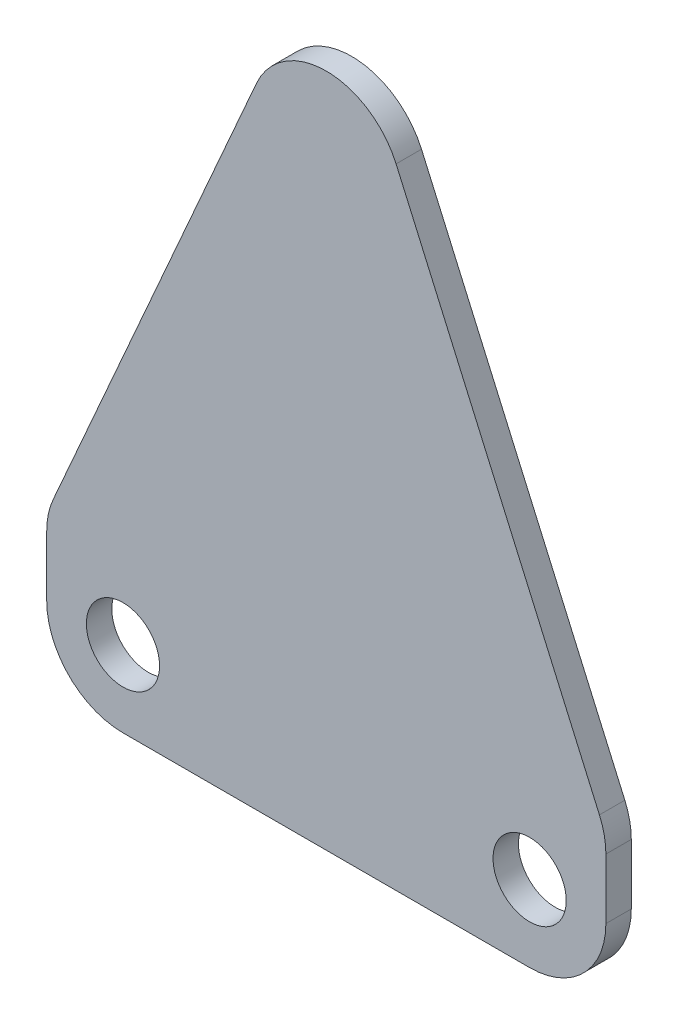
ISO-10303-21;
HEADER;
FILE_DESCRIPTION(('STEP AP214'),'2;1');
FILE_NAME('part.step','',(''),(''),'','','');
FILE_SCHEMA(('AUTOMOTIVE_DESIGN { 1 0 10303 214 1 1 1 1 }'));
ENDSEC;
DATA;
#1=APPLICATION_CONTEXT('core data for automotive mechanical design processes');
#2=APPLICATION_PROTOCOL_DEFINITION('international standard','automotive_design',2000,#1);
#3=PRODUCT_CONTEXT('',#1,'mechanical');
#4=PRODUCT('Part','Part','',(#3));
#5=PRODUCT_RELATED_PRODUCT_CATEGORY('part','',(#4));
#6=PRODUCT_DEFINITION_FORMATION('','',#4);
#7=PRODUCT_DEFINITION_CONTEXT('part definition',#1,'design');
#8=PRODUCT_DEFINITION('design','',#6,#7);
#9=PRODUCT_DEFINITION_SHAPE('','',#8);
#10=(LENGTH_UNIT() NAMED_UNIT(*) SI_UNIT(.MILLI.,.METRE.));
#11=(NAMED_UNIT(*) PLANE_ANGLE_UNIT() SI_UNIT($,.RADIAN.));
#12=(NAMED_UNIT(*) SI_UNIT($,.STERADIAN.) SOLID_ANGLE_UNIT());
#13=UNCERTAINTY_MEASURE_WITH_UNIT(LENGTH_MEASURE(1.E-05),#10,'distance_accuracy_value','');
#14=(GEOMETRIC_REPRESENTATION_CONTEXT(3) GLOBAL_UNCERTAINTY_ASSIGNED_CONTEXT((#13)) GLOBAL_UNIT_ASSIGNED_CONTEXT((#10,
#11,#12)) REPRESENTATION_CONTEXT('',''));
#15=CARTESIAN_POINT('',(0.,0.,0.));
#16=DIRECTION('',(0.,0.,1.));
#17=DIRECTION('',(1.,0.,0.));
#18=AXIS2_PLACEMENT_3D('',#15,#16,#17);
#19=CARTESIAN_POINT('',(0.,0.,1.5875));
#20=DIRECTION('',(0.,0.,-1.));
#21=DIRECTION('',(-1.,0.,0.));
#22=AXIS2_PLACEMENT_3D('',#19,#20,#21);
#23=PLANE('',#22);
#24=DIRECTION('',(0.,-1.,0.));
#25=VECTOR('',#24,1.);
#26=CARTESIAN_POINT('',(-17.4625,9.525,1.5875));
#27=LINE('',#26,#25);
#28=CARTESIAN_POINT('',(-17.4625,8.52357589066396,1.5875));
#29=VERTEX_POINT('',#28);
#30=CARTESIAN_POINT('',(-17.4625,4.7625,1.5875));
#31=VERTEX_POINT('',#30);
#32=EDGE_CURVE('E237',#29,#31,#27,.T.);
#33=ORIENTED_EDGE('',*,*,#32,.T.);
#34=CARTESIAN_POINT('',(-12.7,4.7625,1.5875));
#35=DIRECTION('',(0.,0.,-1.));
#36=DIRECTION('',(-1.,0.,0.));
#37=AXIS2_PLACEMENT_3D('',#34,#35,#36);
#38=CIRCLE('',#37,4.7625);
#39=CARTESIAN_POINT('',(-12.7,0.,1.5875));
#40=VERTEX_POINT('',#39);
#41=EDGE_CURVE('E198',#31,#40,#38,.F.);
#42=ORIENTED_EDGE('',*,*,#41,.T.);
#43=DIRECTION('',(1.,0.,0.));
#44=VECTOR('',#43,1.);
#45=CARTESIAN_POINT('',(-17.4625,0.,1.5875));
#46=LINE('',#45,#44);
#47=CARTESIAN_POINT('',(12.7,0.,1.5875));
#48=VERTEX_POINT('',#47);
#49=EDGE_CURVE('E149',#40,#48,#46,.T.);
#50=ORIENTED_EDGE('',*,*,#49,.T.);
#51=CARTESIAN_POINT('',(12.7,4.7625,1.5875));
#52=DIRECTION('',(0.,0.,-1.));
#53=DIRECTION('',(-1.,0.,0.));
#54=AXIS2_PLACEMENT_3D('',#51,#52,#53);
#55=CIRCLE('',#54,4.7625);
#56=CARTESIAN_POINT('',(17.4625,4.7625,1.5875));
#57=VERTEX_POINT('',#56);
#58=EDGE_CURVE('E192',#48,#57,#55,.F.);
#59=ORIENTED_EDGE('',*,*,#58,.T.);
#60=DIRECTION('',(0.,1.,0.));
#61=VECTOR('',#60,1.);
#62=CARTESIAN_POINT('',(17.4625,0.,1.5875));
#63=LINE('',#62,#61);
#64=CARTESIAN_POINT('',(17.4625,8.52357589066395,1.5875));
#65=VERTEX_POINT('',#64);
#66=EDGE_CURVE('E159',#57,#65,#63,.T.);
#67=ORIENTED_EDGE('',*,*,#66,.T.);
#68=CARTESIAN_POINT('',(12.7,8.52357589066395,1.5875));
#69=DIRECTION('',(0.,0.,-1.));
#70=DIRECTION('',(-1.,0.,0.));
#71=AXIS2_PLACEMENT_3D('',#68,#69,#70);
#72=CIRCLE('',#71,4.7625);
#73=CARTESIAN_POINT('',(17.0591878419134,10.4416185411059,1.5875));
#74=VERTEX_POINT('',#73);
#75=EDGE_CURVE('E187',#65,#74,#72,.F.);
#76=ORIENTED_EDGE('',*,*,#75,.T.);
#77=DIRECTION('',(-0.402738614266017,0.915315032422766,0.));
#78=VECTOR('',#77,1.);
#79=CARTESIAN_POINT('',(17.4625,9.525,1.5875));
#80=LINE('',#79,#78);
#81=CARTESIAN_POINT('',(4.35918784191342,39.3052549047422,1.5875));
#82=VERTEX_POINT('',#81);
#83=EDGE_CURVE('E165',#74,#82,#80,.T.);
#84=ORIENTED_EDGE('',*,*,#83,.T.);
#85=CARTESIAN_POINT('',(0.,37.3872122543003,1.5875));
#86=DIRECTION('',(0.,0.,-1.));
#87=DIRECTION('',(-1.,0.,0.));
#88=AXIS2_PLACEMENT_3D('',#85,#86,#87);
#89=CIRCLE('',#88,4.7625);
#90=CARTESIAN_POINT('',(-4.35918784191342,39.3052549047422,1.5875));
#91=VERTEX_POINT('',#90);
#92=EDGE_CURVE('E72',#82,#91,#89,.F.);
#93=ORIENTED_EDGE('',*,*,#92,.T.);
#94=DIRECTION('',(-0.402738614266017,-0.915315032422766,0.));
#95=VECTOR('',#94,1.);
#96=CARTESIAN_POINT('',(0.,49.2125,1.5875));
#97=LINE('',#96,#95);
#98=CARTESIAN_POINT('',(-17.0591878419134,10.4416185411059,1.5875));
#99=VERTEX_POINT('',#98);
#100=EDGE_CURVE('E241',#91,#99,#97,.T.);
#101=ORIENTED_EDGE('',*,*,#100,.T.);
#102=CARTESIAN_POINT('',(-12.7,8.52357589066396,1.5875));
#103=DIRECTION('',(0.,0.,-1.));
#104=DIRECTION('',(-1.,0.,0.));
#105=AXIS2_PLACEMENT_3D('',#102,#103,#104);
#106=CIRCLE('',#105,4.7625);
#107=EDGE_CURVE('E195',#99,#29,#106,.F.);
#108=ORIENTED_EDGE('',*,*,#107,.T.);
#109=EDGE_LOOP('',(#33,#42,#50,#59,#67,#76,#84,#93,#101,#108));
#110=FACE_BOUND('',#109,.T.);
#111=CARTESIAN_POINT('',(-12.7,4.7625,1.5875));
#112=DIRECTION('',(0.,0.,1.));
#113=DIRECTION('',(1.,0.,0.));
#114=AXIS2_PLACEMENT_3D('',#111,#112,#113);
#115=CIRCLE('',#114,2.286);
#116=CARTESIAN_POINT('',(-10.414,4.7625,1.5875));
#117=VERTEX_POINT('',#116);
#118=EDGE_CURVE('E232',#117,#117,#115,.T.);
#119=ORIENTED_EDGE('',*,*,#118,.F.);
#120=EDGE_LOOP('',(#119));
#121=FACE_BOUND('',#120,.T.);
#122=CARTESIAN_POINT('',(12.7,4.7625,1.5875));
#123=DIRECTION('',(0.,0.,1.));
#124=DIRECTION('',(1.,0.,0.));
#125=AXIS2_PLACEMENT_3D('',#122,#123,#124);
#126=CIRCLE('',#125,2.286);
#127=CARTESIAN_POINT('',(14.986,4.7625,1.5875));
#128=VERTEX_POINT('',#127);
#129=EDGE_CURVE('E250',#128,#128,#126,.T.);
#130=ORIENTED_EDGE('',*,*,#129,.F.);
#131=EDGE_LOOP('',(#130));
#132=FACE_BOUND('',#131,.T.);
#133=ADVANCED_FACE('F49',(#110,#121,#132),#23,.F.);
#134=CARTESIAN_POINT('',(0.,0.,0.));
#135=DIRECTION('',(0.,0.,-1.));
#136=DIRECTION('',(-1.,0.,0.));
#137=AXIS2_PLACEMENT_3D('',#134,#135,#136);
#138=PLANE('',#137);
#139=CARTESIAN_POINT('',(-12.7,4.7625,0.));
#140=DIRECTION('',(0.,0.,1.));
#141=DIRECTION('',(1.,0.,0.));
#142=AXIS2_PLACEMENT_3D('',#139,#140,#141);
#143=CIRCLE('',#142,2.286);
#144=CARTESIAN_POINT('',(-10.414,4.7625,0.));
#145=VERTEX_POINT('',#144);
#146=EDGE_CURVE('E246',#145,#145,#143,.T.);
#147=ORIENTED_EDGE('',*,*,#146,.T.);
#148=EDGE_LOOP('',(#147));
#149=FACE_BOUND('',#148,.T.);
#150=DIRECTION('',(1.,0.,0.));
#151=VECTOR('',#150,1.);
#152=CARTESIAN_POINT('',(-17.4625,0.,0.));
#153=LINE('',#152,#151);
#154=CARTESIAN_POINT('',(-12.7,0.,0.));
#155=VERTEX_POINT('',#154);
#156=CARTESIAN_POINT('',(12.7,0.,0.));
#157=VERTEX_POINT('',#156);
#158=EDGE_CURVE('E146',#155,#157,#153,.T.);
#159=ORIENTED_EDGE('',*,*,#158,.F.);
#160=CARTESIAN_POINT('',(-12.7,4.7625,0.));
#161=DIRECTION('',(0.,0.,-1.));
#162=DIRECTION('',(-1.,0.,0.));
#163=AXIS2_PLACEMENT_3D('',#160,#161,#162);
#164=CIRCLE('',#163,4.7625);
#165=CARTESIAN_POINT('',(-17.4625,4.7625,0.));
#166=VERTEX_POINT('',#165);
#167=EDGE_CURVE('E128',#155,#166,#164,.T.);
#168=ORIENTED_EDGE('',*,*,#167,.T.);
#169=DIRECTION('',(0.,-1.,0.));
#170=VECTOR('',#169,1.);
#171=CARTESIAN_POINT('',(-17.4625,9.525,0.));
#172=LINE('',#171,#170);
#173=CARTESIAN_POINT('',(-17.4625,8.52357589066396,0.));
#174=VERTEX_POINT('',#173);
#175=EDGE_CURVE('E160',#174,#166,#172,.T.);
#176=ORIENTED_EDGE('',*,*,#175,.F.);
#177=CARTESIAN_POINT('',(-12.7,8.52357589066396,0.));
#178=DIRECTION('',(0.,0.,-1.));
#179=DIRECTION('',(-1.,0.,0.));
#180=AXIS2_PLACEMENT_3D('',#177,#178,#179);
#181=CIRCLE('',#180,4.7625);
#182=CARTESIAN_POINT('',(-17.0591878419134,10.4416185411059,0.));
#183=VERTEX_POINT('',#182);
#184=EDGE_CURVE('E140',#174,#183,#181,.T.);
#185=ORIENTED_EDGE('',*,*,#184,.T.);
#186=DIRECTION('',(-0.402738614266017,-0.915315032422766,0.));
#187=VECTOR('',#186,1.);
#188=CARTESIAN_POINT('',(0.,49.2125,0.));
#189=LINE('',#188,#187);
#190=CARTESIAN_POINT('',(-4.35918784191342,39.3052549047422,0.));
#191=VERTEX_POINT('',#190);
#192=EDGE_CURVE('E167',#191,#183,#189,.T.);
#193=ORIENTED_EDGE('',*,*,#192,.F.);
#194=CARTESIAN_POINT('',(0.,37.3872122543003,0.));
#195=DIRECTION('',(0.,0.,-1.));
#196=DIRECTION('',(-1.,0.,0.));
#197=AXIS2_PLACEMENT_3D('',#194,#195,#196);
#198=CIRCLE('',#197,4.7625);
#199=CARTESIAN_POINT('',(4.35918784191342,39.3052549047422,0.));
#200=VERTEX_POINT('',#199);
#201=EDGE_CURVE('E175',#191,#200,#198,.T.);
#202=ORIENTED_EDGE('',*,*,#201,.T.);
#203=DIRECTION('',(-0.402738614266017,0.915315032422766,0.));
#204=VECTOR('',#203,1.);
#205=CARTESIAN_POINT('',(17.4625,9.525,0.));
#206=LINE('',#205,#204);
#207=CARTESIAN_POINT('',(17.0591878419134,10.4416185411059,0.));
#208=VERTEX_POINT('',#207);
#209=EDGE_CURVE('E221',#208,#200,#206,.T.);
#210=ORIENTED_EDGE('',*,*,#209,.F.);
#211=CARTESIAN_POINT('',(12.7,8.52357589066395,0.));
#212=DIRECTION('',(0.,0.,-1.));
#213=DIRECTION('',(-1.,0.,0.));
#214=AXIS2_PLACEMENT_3D('',#211,#212,#213);
#215=CIRCLE('',#214,4.7625);
#216=CARTESIAN_POINT('',(17.4625,8.52357589066395,0.));
#217=VERTEX_POINT('',#216);
#218=EDGE_CURVE('E151',#208,#217,#215,.T.);
#219=ORIENTED_EDGE('',*,*,#218,.T.);
#220=DIRECTION('',(0.,1.,0.));
#221=VECTOR('',#220,1.);
#222=CARTESIAN_POINT('',(17.4625,0.,0.));
#223=LINE('',#222,#221);
#224=CARTESIAN_POINT('',(17.4625,4.7625,0.));
#225=VERTEX_POINT('',#224);
#226=EDGE_CURVE('E228',#225,#217,#223,.T.);
#227=ORIENTED_EDGE('',*,*,#226,.F.);
#228=CARTESIAN_POINT('',(12.7,4.7625,0.));
#229=DIRECTION('',(0.,0.,-1.));
#230=DIRECTION('',(-1.,0.,0.));
#231=AXIS2_PLACEMENT_3D('',#228,#229,#230);
#232=CIRCLE('',#231,4.7625);
#233=EDGE_CURVE('E157',#225,#157,#232,.T.);
#234=ORIENTED_EDGE('',*,*,#233,.T.);
#235=EDGE_LOOP('',(#159,#168,#176,#185,#193,#202,#210,#219,#227,#234));
#236=FACE_BOUND('',#235,.T.);
#237=CARTESIAN_POINT('',(12.7,4.7625,0.));
#238=DIRECTION('',(0.,0.,1.));
#239=DIRECTION('',(1.,0.,0.));
#240=AXIS2_PLACEMENT_3D('',#237,#238,#239);
#241=CIRCLE('',#240,2.286);
#242=CARTESIAN_POINT('',(14.986,4.7625,0.));
#243=VERTEX_POINT('',#242);
#244=EDGE_CURVE('E254',#243,#243,#241,.T.);
#245=ORIENTED_EDGE('',*,*,#244,.T.);
#246=EDGE_LOOP('',(#245));
#247=FACE_BOUND('',#246,.T.);
#248=ADVANCED_FACE('F154',(#149,#236,#247),#138,.T.);
#249=CARTESIAN_POINT('',(17.4625,0.,1.5875));
#250=DIRECTION('',(-1.,0.,0.));
#251=DIRECTION('',(0.,0.,1.));
#252=AXIS2_PLACEMENT_3D('',#249,#250,#251);
#253=PLANE('',#252);
#254=ORIENTED_EDGE('',*,*,#66,.F.);
#255=DIRECTION('',(0.,0.,-1.));
#256=VECTOR('',#255,1.);
#257=CARTESIAN_POINT('',(17.4625,4.7625,1.5875));
#258=LINE('',#257,#256);
#259=EDGE_CURVE('E210',#57,#225,#258,.T.);
#260=ORIENTED_EDGE('',*,*,#259,.T.);
#261=ORIENTED_EDGE('',*,*,#226,.T.);
#262=DIRECTION('',(0.,0.,-1.));
#263=VECTOR('',#262,1.);
#264=CARTESIAN_POINT('',(17.4625,8.52357589066395,1.5875));
#265=LINE('',#264,#263);
#266=EDGE_CURVE('E207',#217,#65,#265,.F.);
#267=ORIENTED_EDGE('',*,*,#266,.T.);
#268=EDGE_LOOP('',(#254,#260,#261,#267));
#269=FACE_BOUND('',#268,.T.);
#270=ADVANCED_FACE('F270',(#269),#253,.F.);
#271=CARTESIAN_POINT('',(17.4625,9.525,1.5875));
#272=DIRECTION('',(-0.915315032422766,-0.402738614266017,0.));
#273=DIRECTION('',(0.402738614266017,-0.915315032422766,0.));
#274=AXIS2_PLACEMENT_3D('',#271,#272,#273);
#275=PLANE('',#274);
#276=ORIENTED_EDGE('',*,*,#209,.T.);
#277=DIRECTION('',(0.,0.,-1.));
#278=VECTOR('',#277,1.);
#279=CARTESIAN_POINT('',(4.35918784191342,39.3052549047422,1.5875));
#280=LINE('',#279,#278);
#281=EDGE_CURVE('E11',#200,#82,#280,.F.);
#282=ORIENTED_EDGE('',*,*,#281,.T.);
#283=ORIENTED_EDGE('',*,*,#83,.F.);
#284=DIRECTION('',(0.,0.,-1.));
#285=VECTOR('',#284,1.);
#286=CARTESIAN_POINT('',(17.0591878419134,10.4416185411059,1.5875));
#287=LINE('',#286,#285);
#288=EDGE_CURVE('E58',#74,#208,#287,.T.);
#289=ORIENTED_EDGE('',*,*,#288,.T.);
#290=EDGE_LOOP('',(#276,#282,#283,#289));
#291=FACE_BOUND('',#290,.T.);
#292=ADVANCED_FACE('F220',(#291),#275,.F.);
#293=CARTESIAN_POINT('',(0.,49.2125,1.5875));
#294=DIRECTION('',(0.915315032422766,-0.402738614266017,0.));
#295=DIRECTION('',(0.402738614266017,0.915315032422766,0.));
#296=AXIS2_PLACEMENT_3D('',#293,#294,#295);
#297=PLANE('',#296);
#298=ORIENTED_EDGE('',*,*,#192,.T.);
#299=DIRECTION('',(0.,0.,-1.));
#300=VECTOR('',#299,1.);
#301=CARTESIAN_POINT('',(-17.0591878419134,10.4416185411059,1.5875));
#302=LINE('',#301,#300);
#303=EDGE_CURVE('E65',#183,#99,#302,.F.);
#304=ORIENTED_EDGE('',*,*,#303,.T.);
#305=ORIENTED_EDGE('',*,*,#100,.F.);
#306=DIRECTION('',(0.,0.,-1.));
#307=VECTOR('',#306,1.);
#308=CARTESIAN_POINT('',(-4.35918784191342,39.3052549047422,1.5875));
#309=LINE('',#308,#307);
#310=EDGE_CURVE('E201',#91,#191,#309,.T.);
#311=ORIENTED_EDGE('',*,*,#310,.T.);
#312=EDGE_LOOP('',(#298,#304,#305,#311));
#313=FACE_BOUND('',#312,.T.);
#314=ADVANCED_FACE('F283',(#313),#297,.F.);
#315=CARTESIAN_POINT('',(-17.4625,9.525,1.5875));
#316=DIRECTION('',(1.,0.,0.));
#317=DIRECTION('',(0.,0.,-1.));
#318=AXIS2_PLACEMENT_3D('',#315,#316,#317);
#319=PLANE('',#318);
#320=ORIENTED_EDGE('',*,*,#175,.T.);
#321=DIRECTION('',(0.,0.,-1.));
#322=VECTOR('',#321,1.);
#323=CARTESIAN_POINT('',(-17.4625,4.7625,1.5875));
#324=LINE('',#323,#322);
#325=EDGE_CURVE('E133',#166,#31,#324,.F.);
#326=ORIENTED_EDGE('',*,*,#325,.T.);
#327=ORIENTED_EDGE('',*,*,#32,.F.);
#328=DIRECTION('',(0.,0.,-1.));
#329=VECTOR('',#328,1.);
#330=CARTESIAN_POINT('',(-17.4625,8.52357589066396,1.5875));
#331=LINE('',#330,#329);
#332=EDGE_CURVE('E139',#29,#174,#331,.T.);
#333=ORIENTED_EDGE('',*,*,#332,.T.);
#334=EDGE_LOOP('',(#320,#326,#327,#333));
#335=FACE_BOUND('',#334,.T.);
#336=ADVANCED_FACE('F280',(#335),#319,.F.);
#337=CARTESIAN_POINT('',(-17.4625,0.,1.5875));
#338=DIRECTION('',(0.,1.,0.));
#339=DIRECTION('',(0.,0.,1.));
#340=AXIS2_PLACEMENT_3D('',#337,#338,#339);
#341=PLANE('',#340);
#342=ORIENTED_EDGE('',*,*,#49,.F.);
#343=DIRECTION('',(0.,0.,-1.));
#344=VECTOR('',#343,1.);
#345=CARTESIAN_POINT('',(-12.7,0.,1.5875));
#346=LINE('',#345,#344);
#347=EDGE_CURVE('E132',#40,#155,#346,.T.);
#348=ORIENTED_EDGE('',*,*,#347,.T.);
#349=ORIENTED_EDGE('',*,*,#158,.T.);
#350=DIRECTION('',(0.,0.,-1.));
#351=VECTOR('',#350,1.);
#352=CARTESIAN_POINT('',(12.7,0.,1.5875));
#353=LINE('',#352,#351);
#354=EDGE_CURVE('E152',#157,#48,#353,.F.);
#355=ORIENTED_EDGE('',*,*,#354,.T.);
#356=EDGE_LOOP('',(#342,#348,#349,#355));
#357=FACE_BOUND('',#356,.T.);
#358=ADVANCED_FACE('F145',(#357),#341,.F.);
#359=CARTESIAN_POINT('',(-12.7,4.7625,1.5875));
#360=DIRECTION('',(0.,0.,-1.));
#361=DIRECTION('',(-1.,0.,0.));
#362=AXIS2_PLACEMENT_3D('',#359,#360,#361);
#363=CYLINDRICAL_SURFACE('',#362,2.286);
#364=ORIENTED_EDGE('',*,*,#118,.T.);
#365=EDGE_LOOP('',(#364));
#366=FACE_BOUND('',#365,.T.);
#367=ORIENTED_EDGE('',*,*,#146,.F.);
#368=EDGE_LOOP('',(#367));
#369=FACE_BOUND('',#368,.T.);
#370=ADVANCED_FACE('F275',(#366,#369),#363,.F.);
#371=CARTESIAN_POINT('',(12.7,4.7625,1.5875));
#372=DIRECTION('',(0.,0.,-1.));
#373=DIRECTION('',(-1.,0.,0.));
#374=AXIS2_PLACEMENT_3D('',#371,#372,#373);
#375=CYLINDRICAL_SURFACE('',#374,2.286);
#376=ORIENTED_EDGE('',*,*,#129,.T.);
#377=EDGE_LOOP('',(#376));
#378=FACE_BOUND('',#377,.T.);
#379=ORIENTED_EDGE('',*,*,#244,.F.);
#380=EDGE_LOOP('',(#379));
#381=FACE_BOUND('',#380,.T.);
#382=ADVANCED_FACE('F262',(#378,#381),#375,.F.);
#383=CARTESIAN_POINT('',(-12.7,4.7625,1.5875));
#384=DIRECTION('',(0.,0.,-1.));
#385=DIRECTION('',(-1.,0.,0.));
#386=AXIS2_PLACEMENT_3D('',#383,#384,#385);
#387=CYLINDRICAL_SURFACE('',#386,4.7625);
#388=ORIENTED_EDGE('',*,*,#41,.F.);
#389=ORIENTED_EDGE('',*,*,#325,.F.);
#390=ORIENTED_EDGE('',*,*,#167,.F.);
#391=ORIENTED_EDGE('',*,*,#347,.F.);
#392=EDGE_LOOP('',(#388,#389,#390,#391));
#393=FACE_BOUND('',#392,.T.);
#394=ADVANCED_FACE('F131',(#393),#387,.T.);
#395=CARTESIAN_POINT('',(-12.7,8.52357589066396,1.5875));
#396=DIRECTION('',(0.,0.,-1.));
#397=DIRECTION('',(-1.,0.,0.));
#398=AXIS2_PLACEMENT_3D('',#395,#396,#397);
#399=CYLINDRICAL_SURFACE('',#398,4.7625);
#400=ORIENTED_EDGE('',*,*,#107,.F.);
#401=ORIENTED_EDGE('',*,*,#303,.F.);
#402=ORIENTED_EDGE('',*,*,#184,.F.);
#403=ORIENTED_EDGE('',*,*,#332,.F.);
#404=EDGE_LOOP('',(#400,#401,#402,#403));
#405=FACE_BOUND('',#404,.T.);
#406=ADVANCED_FACE('F294',(#405),#399,.T.);
#407=CARTESIAN_POINT('',(12.7,4.7625,1.5875));
#408=DIRECTION('',(0.,0.,-1.));
#409=DIRECTION('',(-1.,0.,0.));
#410=AXIS2_PLACEMENT_3D('',#407,#408,#409);
#411=CYLINDRICAL_SURFACE('',#410,4.7625);
#412=ORIENTED_EDGE('',*,*,#58,.F.);
#413=ORIENTED_EDGE('',*,*,#354,.F.);
#414=ORIENTED_EDGE('',*,*,#233,.F.);
#415=ORIENTED_EDGE('',*,*,#259,.F.);
#416=EDGE_LOOP('',(#412,#413,#414,#415));
#417=FACE_BOUND('',#416,.T.);
#418=ADVANCED_FACE('F297',(#417),#411,.T.);
#419=CARTESIAN_POINT('',(0.,37.3872122543003,1.5875));
#420=DIRECTION('',(0.,0.,-1.));
#421=DIRECTION('',(-1.,0.,0.));
#422=AXIS2_PLACEMENT_3D('',#419,#420,#421);
#423=CYLINDRICAL_SURFACE('',#422,4.7625);
#424=ORIENTED_EDGE('',*,*,#92,.F.);
#425=ORIENTED_EDGE('',*,*,#281,.F.);
#426=ORIENTED_EDGE('',*,*,#201,.F.);
#427=ORIENTED_EDGE('',*,*,#310,.F.);
#428=EDGE_LOOP('',(#424,#425,#426,#427));
#429=FACE_BOUND('',#428,.T.);
#430=ADVANCED_FACE('F300',(#429),#423,.T.);
#431=CARTESIAN_POINT('',(12.7,8.52357589066395,1.5875));
#432=DIRECTION('',(0.,0.,-1.));
#433=DIRECTION('',(-1.,0.,0.));
#434=AXIS2_PLACEMENT_3D('',#431,#432,#433);
#435=CYLINDRICAL_SURFACE('',#434,4.7625);
#436=ORIENTED_EDGE('',*,*,#75,.F.);
#437=ORIENTED_EDGE('',*,*,#266,.F.);
#438=ORIENTED_EDGE('',*,*,#218,.F.);
#439=ORIENTED_EDGE('',*,*,#288,.F.);
#440=EDGE_LOOP('',(#436,#437,#438,#439));
#441=FACE_BOUND('',#440,.T.);
#442=ADVANCED_FACE('F51',(#441),#435,.T.);
#443=CLOSED_SHELL('',(#133,#248,#270,#292,#314,#336,#358,#370,#382,#394,#406,#418,#430,#442));
#444=MANIFOLD_SOLID_BREP('B2',#443);
#445=ADVANCED_BREP_SHAPE_REPRESENTATION('',(#18,#444),#14);
#446=SHAPE_DEFINITION_REPRESENTATION(#9,#445);
ENDSEC;
END-ISO-10303-21;
